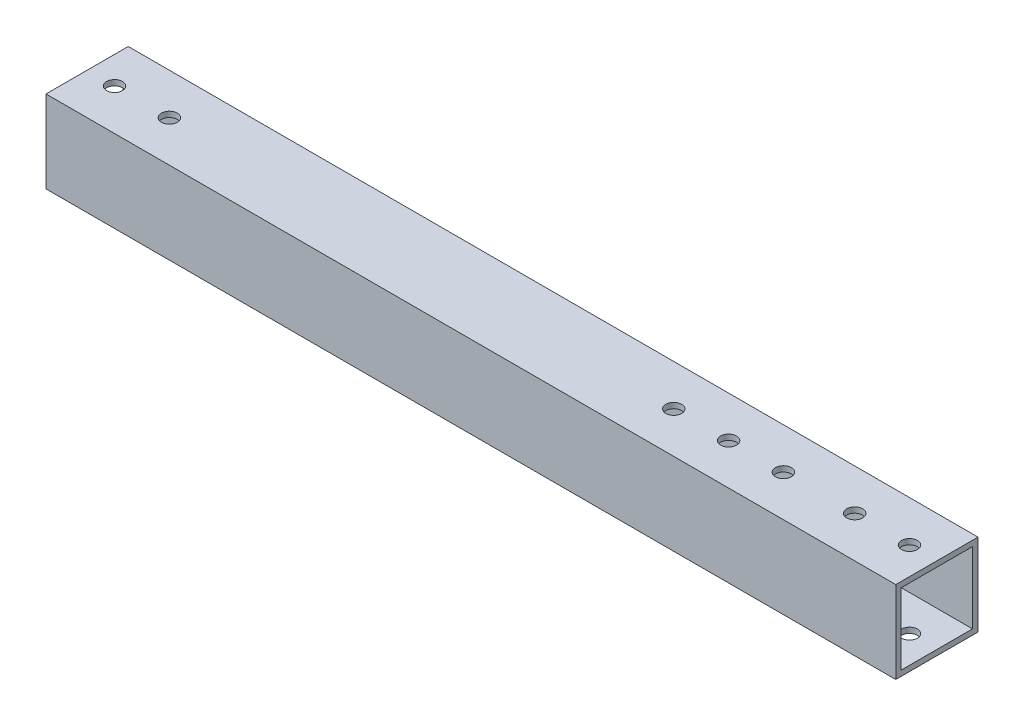
ISO-10303-21;
HEADER;
FILE_DESCRIPTION(('STEP AP214'),'2;1');
FILE_NAME('part.step','',(''),(''),'','','');
FILE_SCHEMA(('AUTOMOTIVE_DESIGN { 1 0 10303 214 1 1 1 1 }'));
ENDSEC;
DATA;
#1=APPLICATION_CONTEXT('core data for automotive mechanical design processes');
#2=APPLICATION_PROTOCOL_DEFINITION('international standard','automotive_design',2000,#1);
#3=PRODUCT_CONTEXT('',#1,'mechanical');
#4=PRODUCT('Part','Part','',(#3));
#5=PRODUCT_RELATED_PRODUCT_CATEGORY('part','',(#4));
#6=PRODUCT_DEFINITION_FORMATION('','',#4);
#7=PRODUCT_DEFINITION_CONTEXT('part definition',#1,'design');
#8=PRODUCT_DEFINITION('design','',#6,#7);
#9=PRODUCT_DEFINITION_SHAPE('','',#8);
#10=(LENGTH_UNIT() NAMED_UNIT(*) SI_UNIT(.MILLI.,.METRE.));
#11=(NAMED_UNIT(*) PLANE_ANGLE_UNIT() SI_UNIT($,.RADIAN.));
#12=(NAMED_UNIT(*) SI_UNIT($,.STERADIAN.) SOLID_ANGLE_UNIT());
#13=UNCERTAINTY_MEASURE_WITH_UNIT(LENGTH_MEASURE(1.E-05),#10,'distance_accuracy_value','');
#14=(GEOMETRIC_REPRESENTATION_CONTEXT(3) GLOBAL_UNCERTAINTY_ASSIGNED_CONTEXT((#13)) GLOBAL_UNIT_ASSIGNED_CONTEXT((#10,
#11,#12)) REPRESENTATION_CONTEXT('',''));
#15=CARTESIAN_POINT('',(0.,0.,0.));
#16=DIRECTION('',(0.,0.,1.));
#17=DIRECTION('',(1.,0.,0.));
#18=AXIS2_PLACEMENT_3D('',#15,#16,#17);
#19=CARTESIAN_POINT('',(155.,0.,0.));
#20=DIRECTION('',(-1.,0.,0.));
#21=DIRECTION('',(0.,0.,1.));
#22=AXIS2_PLACEMENT_3D('',#19,#20,#21);
#23=PLANE('',#22);
#24=DIRECTION('',(0.,1.,0.));
#25=VECTOR('',#24,1.);
#26=CARTESIAN_POINT('',(155.,-7.5,-7.5));
#27=LINE('',#26,#25);
#28=CARTESIAN_POINT('',(155.,-7.5,-7.5));
#29=VERTEX_POINT('',#28);
#30=CARTESIAN_POINT('',(155.,7.5,-7.5));
#31=VERTEX_POINT('',#30);
#32=EDGE_CURVE('E163',#29,#31,#27,.T.);
#33=ORIENTED_EDGE('',*,*,#32,.T.);
#34=DIRECTION('',(0.,0.,1.));
#35=VECTOR('',#34,1.);
#36=CARTESIAN_POINT('',(155.,7.5,7.5));
#37=LINE('',#36,#35);
#38=CARTESIAN_POINT('',(155.,7.5,7.5));
#39=VERTEX_POINT('',#38);
#40=EDGE_CURVE('E167',#31,#39,#37,.T.);
#41=ORIENTED_EDGE('',*,*,#40,.T.);
#42=DIRECTION('',(0.,-1.,0.));
#43=VECTOR('',#42,1.);
#44=CARTESIAN_POINT('',(155.,-7.5,7.5));
#45=LINE('',#44,#43);
#46=CARTESIAN_POINT('',(155.,-7.5,7.5));
#47=VERTEX_POINT('',#46);
#48=EDGE_CURVE('E171',#39,#47,#45,.T.);
#49=ORIENTED_EDGE('',*,*,#48,.T.);
#50=DIRECTION('',(0.,0.,-1.));
#51=VECTOR('',#50,1.);
#52=CARTESIAN_POINT('',(155.,-7.5,7.5));
#53=LINE('',#52,#51);
#54=EDGE_CURVE('E174',#47,#29,#53,.T.);
#55=ORIENTED_EDGE('',*,*,#54,.T.);
#56=EDGE_LOOP('',(#33,#41,#49,#55));
#57=FACE_BOUND('',#56,.T.);
#58=DIRECTION('',(0.,0.,-1.));
#59=VECTOR('',#58,1.);
#60=CARTESIAN_POINT('',(155.,-6.5,6.5));
#61=LINE('',#60,#59);
#62=CARTESIAN_POINT('',(155.,-6.5,6.5));
#63=VERTEX_POINT('',#62);
#64=CARTESIAN_POINT('',(155.,-6.5,-6.5));
#65=VERTEX_POINT('',#64);
#66=EDGE_CURVE('E112',#63,#65,#61,.T.);
#67=ORIENTED_EDGE('',*,*,#66,.F.);
#68=DIRECTION('',(0.,-1.,0.));
#69=VECTOR('',#68,1.);
#70=CARTESIAN_POINT('',(155.,-6.5,6.5));
#71=LINE('',#70,#69);
#72=CARTESIAN_POINT('',(155.,6.5,6.5));
#73=VERTEX_POINT('',#72);
#74=EDGE_CURVE('E140',#73,#63,#71,.T.);
#75=ORIENTED_EDGE('',*,*,#74,.F.);
#76=DIRECTION('',(0.,0.,1.));
#77=VECTOR('',#76,1.);
#78=CARTESIAN_POINT('',(155.,6.5,6.5));
#79=LINE('',#78,#77);
#80=CARTESIAN_POINT('',(155.,6.5,-6.5));
#81=VERTEX_POINT('',#80);
#82=EDGE_CURVE('E134',#81,#73,#79,.T.);
#83=ORIENTED_EDGE('',*,*,#82,.F.);
#84=DIRECTION('',(0.,1.,0.));
#85=VECTOR('',#84,1.);
#86=CARTESIAN_POINT('',(155.,-6.5,-6.5));
#87=LINE('',#86,#85);
#88=EDGE_CURVE('E121',#65,#81,#87,.T.);
#89=ORIENTED_EDGE('',*,*,#88,.F.);
#90=EDGE_LOOP('',(#67,#75,#83,#89));
#91=FACE_BOUND('',#90,.T.);
#92=ADVANCED_FACE('F44',(#57,#91),#23,.F.);
#93=CARTESIAN_POINT('',(0.,0.,0.));
#94=DIRECTION('',(-1.,0.,0.));
#95=DIRECTION('',(0.,0.,1.));
#96=AXIS2_PLACEMENT_3D('',#93,#94,#95);
#97=PLANE('',#96);
#98=DIRECTION('',(0.,1.,0.));
#99=VECTOR('',#98,1.);
#100=CARTESIAN_POINT('',(0.,-7.5,-7.5));
#101=LINE('',#100,#99);
#102=CARTESIAN_POINT('',(0.,-7.5,-7.5));
#103=VERTEX_POINT('',#102);
#104=CARTESIAN_POINT('',(0.,7.5,-7.5));
#105=VERTEX_POINT('',#104);
#106=EDGE_CURVE('E130',#103,#105,#101,.T.);
#107=ORIENTED_EDGE('',*,*,#106,.F.);
#108=DIRECTION('',(0.,0.,-1.));
#109=VECTOR('',#108,1.);
#110=CARTESIAN_POINT('',(0.,-7.5,7.5));
#111=LINE('',#110,#109);
#112=CARTESIAN_POINT('',(0.,-7.5,7.5));
#113=VERTEX_POINT('',#112);
#114=EDGE_CURVE('E168',#113,#103,#111,.T.);
#115=ORIENTED_EDGE('',*,*,#114,.F.);
#116=DIRECTION('',(0.,-1.,0.));
#117=VECTOR('',#116,1.);
#118=CARTESIAN_POINT('',(0.,-7.5,7.5));
#119=LINE('',#118,#117);
#120=CARTESIAN_POINT('',(0.,7.5,7.5));
#121=VERTEX_POINT('',#120);
#122=EDGE_CURVE('E184',#121,#113,#119,.T.);
#123=ORIENTED_EDGE('',*,*,#122,.F.);
#124=DIRECTION('',(0.,0.,1.));
#125=VECTOR('',#124,1.);
#126=CARTESIAN_POINT('',(0.,7.5,7.5));
#127=LINE('',#126,#125);
#128=EDGE_CURVE('E181',#105,#121,#127,.T.);
#129=ORIENTED_EDGE('',*,*,#128,.F.);
#130=EDGE_LOOP('',(#107,#115,#123,#129));
#131=FACE_BOUND('',#130,.T.);
#132=DIRECTION('',(0.,-1.,0.));
#133=VECTOR('',#132,1.);
#134=CARTESIAN_POINT('',(0.,-6.5,6.5));
#135=LINE('',#134,#133);
#136=CARTESIAN_POINT('',(0.,6.5,6.5));
#137=VERTEX_POINT('',#136);
#138=CARTESIAN_POINT('',(0.,-6.5,6.5));
#139=VERTEX_POINT('',#138);
#140=EDGE_CURVE('E122',#137,#139,#135,.T.);
#141=ORIENTED_EDGE('',*,*,#140,.T.);
#142=DIRECTION('',(0.,0.,-1.));
#143=VECTOR('',#142,1.);
#144=CARTESIAN_POINT('',(0.,-6.5,6.5));
#145=LINE('',#144,#143);
#146=CARTESIAN_POINT('',(0.,-6.5,-6.5));
#147=VERTEX_POINT('',#146);
#148=EDGE_CURVE('E70',#139,#147,#145,.T.);
#149=ORIENTED_EDGE('',*,*,#148,.T.);
#150=DIRECTION('',(0.,1.,0.));
#151=VECTOR('',#150,1.);
#152=CARTESIAN_POINT('',(0.,-6.5,-6.5));
#153=LINE('',#152,#151);
#154=CARTESIAN_POINT('',(0.,6.5,-6.5));
#155=VERTEX_POINT('',#154);
#156=EDGE_CURVE('E128',#147,#155,#153,.T.);
#157=ORIENTED_EDGE('',*,*,#156,.T.);
#158=DIRECTION('',(0.,0.,1.));
#159=VECTOR('',#158,1.);
#160=CARTESIAN_POINT('',(0.,6.5,6.5));
#161=LINE('',#160,#159);
#162=EDGE_CURVE('E151',#155,#137,#161,.T.);
#163=ORIENTED_EDGE('',*,*,#162,.T.);
#164=EDGE_LOOP('',(#141,#149,#157,#163));
#165=FACE_BOUND('',#164,.T.);
#166=ADVANCED_FACE('F273',(#131,#165),#97,.T.);
#167=CARTESIAN_POINT('',(155.,-7.5,-7.5));
#168=DIRECTION('',(0.,0.,1.));
#169=DIRECTION('',(1.,0.,0.));
#170=AXIS2_PLACEMENT_3D('',#167,#168,#169);
#171=PLANE('',#170);
#172=ORIENTED_EDGE('',*,*,#106,.T.);
#173=DIRECTION('',(-1.,0.,0.));
#174=VECTOR('',#173,1.);
#175=CARTESIAN_POINT('',(155.,7.5,-7.5));
#176=LINE('',#175,#174);
#177=EDGE_CURVE('E11',#31,#105,#176,.T.);
#178=ORIENTED_EDGE('',*,*,#177,.F.);
#179=ORIENTED_EDGE('',*,*,#32,.F.);
#180=DIRECTION('',(-1.,0.,0.));
#181=VECTOR('',#180,1.);
#182=CARTESIAN_POINT('',(155.,-7.5,-7.5));
#183=LINE('',#182,#181);
#184=EDGE_CURVE('E177',#29,#103,#183,.T.);
#185=ORIENTED_EDGE('',*,*,#184,.T.);
#186=EDGE_LOOP('',(#172,#178,#179,#185));
#187=FACE_BOUND('',#186,.T.);
#188=ADVANCED_FACE('F46',(#187),#171,.F.);
#189=CARTESIAN_POINT('',(155.,7.5,7.5));
#190=DIRECTION('',(0.,-1.,0.));
#191=DIRECTION('',(0.,0.,-1.));
#192=AXIS2_PLACEMENT_3D('',#189,#190,#191);
#193=PLANE('',#192);
#194=CARTESIAN_POINT('',(5.00000000000016,7.5,0.));
#195=DIRECTION('',(0.,1.,0.));
#196=DIRECTION('',(0.,0.,1.));
#197=AXIS2_PLACEMENT_3D('',#194,#195,#196);
#198=CIRCLE('',#197,1.45);
#199=CARTESIAN_POINT('',(5.00000000000016,7.5,1.45));
#200=VERTEX_POINT('',#199);
#201=EDGE_CURVE('E310',#200,#200,#198,.T.);
#202=ORIENTED_EDGE('',*,*,#201,.F.);
#203=EDGE_LOOP('',(#202));
#204=FACE_BOUND('',#203,.T.);
#205=CARTESIAN_POINT('',(107.,7.5,0.));
#206=DIRECTION('',(0.,1.,0.));
#207=DIRECTION('',(0.,0.,1.));
#208=AXIS2_PLACEMENT_3D('',#205,#206,#207);
#209=CIRCLE('',#208,1.45);
#210=CARTESIAN_POINT('',(107.,7.5,1.45));
#211=VERTEX_POINT('',#210);
#212=EDGE_CURVE('E314',#211,#211,#209,.T.);
#213=ORIENTED_EDGE('',*,*,#212,.F.);
#214=EDGE_LOOP('',(#213));
#215=FACE_BOUND('',#214,.T.);
#216=CARTESIAN_POINT('',(117.,7.5,0.));
#217=DIRECTION('',(0.,1.,0.));
#218=DIRECTION('',(0.,0.,1.));
#219=AXIS2_PLACEMENT_3D('',#216,#217,#218);
#220=CIRCLE('',#219,1.45);
#221=CARTESIAN_POINT('',(117.,7.5,1.45));
#222=VERTEX_POINT('',#221);
#223=EDGE_CURVE('E318',#222,#222,#220,.T.);
#224=ORIENTED_EDGE('',*,*,#223,.F.);
#225=EDGE_LOOP('',(#224));
#226=FACE_BOUND('',#225,.T.);
#227=CARTESIAN_POINT('',(15.0000000000002,7.5,0.));
#228=DIRECTION('',(0.,1.,0.));
#229=DIRECTION('',(0.,0.,1.));
#230=AXIS2_PLACEMENT_3D('',#227,#228,#229);
#231=CIRCLE('',#230,1.45);
#232=CARTESIAN_POINT('',(15.0000000000002,7.5,1.45));
#233=VERTEX_POINT('',#232);
#234=EDGE_CURVE('E322',#233,#233,#231,.T.);
#235=ORIENTED_EDGE('',*,*,#234,.F.);
#236=EDGE_LOOP('',(#235));
#237=FACE_BOUND('',#236,.T.);
#238=CARTESIAN_POINT('',(140.,7.5,0.));
#239=DIRECTION('',(0.,1.,0.));
#240=DIRECTION('',(0.,0.,1.));
#241=AXIS2_PLACEMENT_3D('',#238,#239,#240);
#242=CIRCLE('',#241,1.45);
#243=CARTESIAN_POINT('',(140.,7.5,1.45000000000002));
#244=VERTEX_POINT('',#243);
#245=EDGE_CURVE('E326',#244,#244,#242,.T.);
#246=ORIENTED_EDGE('',*,*,#245,.F.);
#247=EDGE_LOOP('',(#246));
#248=FACE_BOUND('',#247,.T.);
#249=CARTESIAN_POINT('',(150.,7.5,0.));
#250=DIRECTION('',(0.,1.,0.));
#251=DIRECTION('',(0.,0.,1.));
#252=AXIS2_PLACEMENT_3D('',#249,#250,#251);
#253=CIRCLE('',#252,1.45);
#254=CARTESIAN_POINT('',(150.,7.5,1.45000000000002));
#255=VERTEX_POINT('',#254);
#256=EDGE_CURVE('E330',#255,#255,#253,.T.);
#257=ORIENTED_EDGE('',*,*,#256,.F.);
#258=EDGE_LOOP('',(#257));
#259=FACE_BOUND('',#258,.T.);
#260=CARTESIAN_POINT('',(127.,7.5,0.));
#261=DIRECTION('',(0.,1.,0.));
#262=DIRECTION('',(0.,0.,1.));
#263=AXIS2_PLACEMENT_3D('',#260,#261,#262);
#264=CIRCLE('',#263,1.45);
#265=CARTESIAN_POINT('',(127.,7.5,1.45));
#266=VERTEX_POINT('',#265);
#267=EDGE_CURVE('E334',#266,#266,#264,.T.);
#268=ORIENTED_EDGE('',*,*,#267,.F.);
#269=EDGE_LOOP('',(#268));
#270=FACE_BOUND('',#269,.T.);
#271=ORIENTED_EDGE('',*,*,#128,.T.);
#272=DIRECTION('',(-1.,0.,0.));
#273=VECTOR('',#272,1.);
#274=CARTESIAN_POINT('',(155.,7.5,7.5));
#275=LINE('',#274,#273);
#276=EDGE_CURVE('E54',#39,#121,#275,.T.);
#277=ORIENTED_EDGE('',*,*,#276,.F.);
#278=ORIENTED_EDGE('',*,*,#40,.F.);
#279=ORIENTED_EDGE('',*,*,#177,.T.);
#280=EDGE_LOOP('',(#271,#277,#278,#279));
#281=FACE_BOUND('',#280,.T.);
#282=ADVANCED_FACE('F300',(#204,#215,#226,#237,#248,#259,#270,#281),#193,.F.);
#283=CARTESIAN_POINT('',(155.,-7.5,7.5));
#284=DIRECTION('',(0.,0.,-1.));
#285=DIRECTION('',(-1.,0.,0.));
#286=AXIS2_PLACEMENT_3D('',#283,#284,#285);
#287=PLANE('',#286);
#288=ORIENTED_EDGE('',*,*,#122,.T.);
#289=DIRECTION('',(-1.,0.,0.));
#290=VECTOR('',#289,1.);
#291=CARTESIAN_POINT('',(155.,-7.5,7.5));
#292=LINE('',#291,#290);
#293=EDGE_CURVE('E191',#47,#113,#292,.T.);
#294=ORIENTED_EDGE('',*,*,#293,.F.);
#295=ORIENTED_EDGE('',*,*,#48,.F.);
#296=ORIENTED_EDGE('',*,*,#276,.T.);
#297=EDGE_LOOP('',(#288,#294,#295,#296));
#298=FACE_BOUND('',#297,.T.);
#299=ADVANCED_FACE('F297',(#298),#287,.F.);
#300=CARTESIAN_POINT('',(155.,-7.5,7.5));
#301=DIRECTION('',(0.,1.,0.));
#302=DIRECTION('',(0.,0.,1.));
#303=AXIS2_PLACEMENT_3D('',#300,#301,#302);
#304=PLANE('',#303);
#305=CARTESIAN_POINT('',(5.00000000000016,-7.5,0.));
#306=DIRECTION('',(0.,1.,0.));
#307=DIRECTION('',(0.,0.,1.));
#308=AXIS2_PLACEMENT_3D('',#305,#306,#307);
#309=CIRCLE('',#308,1.45);
#310=CARTESIAN_POINT('',(5.00000000000016,-7.5,1.45));
#311=VERTEX_POINT('',#310);
#312=EDGE_CURVE('E203',#311,#311,#309,.T.);
#313=ORIENTED_EDGE('',*,*,#312,.T.);
#314=EDGE_LOOP('',(#313));
#315=FACE_BOUND('',#314,.T.);
#316=CARTESIAN_POINT('',(107.,-7.5,0.));
#317=DIRECTION('',(0.,1.,0.));
#318=DIRECTION('',(0.,0.,1.));
#319=AXIS2_PLACEMENT_3D('',#316,#317,#318);
#320=CIRCLE('',#319,1.45);
#321=CARTESIAN_POINT('',(107.,-7.5,1.45));
#322=VERTEX_POINT('',#321);
#323=EDGE_CURVE('E440',#322,#322,#320,.T.);
#324=ORIENTED_EDGE('',*,*,#323,.T.);
#325=EDGE_LOOP('',(#324));
#326=FACE_BOUND('',#325,.T.);
#327=CARTESIAN_POINT('',(117.,-7.5,0.));
#328=DIRECTION('',(0.,1.,0.));
#329=DIRECTION('',(0.,0.,1.));
#330=AXIS2_PLACEMENT_3D('',#327,#328,#329);
#331=CIRCLE('',#330,1.45);
#332=CARTESIAN_POINT('',(117.,-7.5,1.45));
#333=VERTEX_POINT('',#332);
#334=EDGE_CURVE('E445',#333,#333,#331,.T.);
#335=ORIENTED_EDGE('',*,*,#334,.T.);
#336=EDGE_LOOP('',(#335));
#337=FACE_BOUND('',#336,.T.);
#338=CARTESIAN_POINT('',(15.0000000000002,-7.5,0.));
#339=DIRECTION('',(0.,1.,0.));
#340=DIRECTION('',(0.,0.,1.));
#341=AXIS2_PLACEMENT_3D('',#338,#339,#340);
#342=CIRCLE('',#341,1.45);
#343=CARTESIAN_POINT('',(15.0000000000002,-7.5,1.45));
#344=VERTEX_POINT('',#343);
#345=EDGE_CURVE('E361',#344,#344,#342,.T.);
#346=ORIENTED_EDGE('',*,*,#345,.T.);
#347=EDGE_LOOP('',(#346));
#348=FACE_BOUND('',#347,.T.);
#349=CARTESIAN_POINT('',(140.,-7.5,0.));
#350=DIRECTION('',(0.,1.,0.));
#351=DIRECTION('',(0.,0.,1.));
#352=AXIS2_PLACEMENT_3D('',#349,#350,#351);
#353=CIRCLE('',#352,1.45);
#354=CARTESIAN_POINT('',(140.,-7.5,1.45000000000002));
#355=VERTEX_POINT('',#354);
#356=EDGE_CURVE('E367',#355,#355,#353,.T.);
#357=ORIENTED_EDGE('',*,*,#356,.T.);
#358=EDGE_LOOP('',(#357));
#359=FACE_BOUND('',#358,.T.);
#360=CARTESIAN_POINT('',(150.,-7.5,0.));
#361=DIRECTION('',(0.,1.,0.));
#362=DIRECTION('',(0.,0.,1.));
#363=AXIS2_PLACEMENT_3D('',#360,#361,#362);
#364=CIRCLE('',#363,1.45);
#365=CARTESIAN_POINT('',(150.,-7.5,1.45000000000002));
#366=VERTEX_POINT('',#365);
#367=EDGE_CURVE('E348',#366,#366,#364,.T.);
#368=ORIENTED_EDGE('',*,*,#367,.T.);
#369=EDGE_LOOP('',(#368));
#370=FACE_BOUND('',#369,.T.);
#371=CARTESIAN_POINT('',(127.,-7.5,0.));
#372=DIRECTION('',(0.,1.,0.));
#373=DIRECTION('',(0.,0.,1.));
#374=AXIS2_PLACEMENT_3D('',#371,#372,#373);
#375=CIRCLE('',#374,1.45);
#376=CARTESIAN_POINT('',(127.,-7.5,1.45));
#377=VERTEX_POINT('',#376);
#378=EDGE_CURVE('E349',#377,#377,#375,.T.);
#379=ORIENTED_EDGE('',*,*,#378,.T.);
#380=EDGE_LOOP('',(#379));
#381=FACE_BOUND('',#380,.T.);
#382=ORIENTED_EDGE('',*,*,#114,.T.);
#383=ORIENTED_EDGE('',*,*,#184,.F.);
#384=ORIENTED_EDGE('',*,*,#54,.F.);
#385=ORIENTED_EDGE('',*,*,#293,.T.);
#386=EDGE_LOOP('',(#382,#383,#384,#385));
#387=FACE_BOUND('',#386,.T.);
#388=ADVANCED_FACE('F294',(#315,#326,#337,#348,#359,#370,#381,#387),#304,.F.);
#389=CARTESIAN_POINT('',(155.,-6.5,6.5));
#390=DIRECTION('',(0.,1.,0.));
#391=DIRECTION('',(0.,0.,1.));
#392=AXIS2_PLACEMENT_3D('',#389,#390,#391);
#393=PLANE('',#392);
#394=CARTESIAN_POINT('',(5.00000000000016,-6.5,0.));
#395=DIRECTION('',(0.,1.,0.));
#396=DIRECTION('',(0.,0.,1.));
#397=AXIS2_PLACEMENT_3D('',#394,#395,#396);
#398=CIRCLE('',#397,1.45);
#399=CARTESIAN_POINT('',(5.00000000000016,-6.5,1.45));
#400=VERTEX_POINT('',#399);
#401=EDGE_CURVE('E148',#400,#400,#398,.T.);
#402=ORIENTED_EDGE('',*,*,#401,.F.);
#403=EDGE_LOOP('',(#402));
#404=FACE_BOUND('',#403,.T.);
#405=CARTESIAN_POINT('',(107.,-6.5,0.));
#406=DIRECTION('',(0.,1.,0.));
#407=DIRECTION('',(0.,0.,1.));
#408=AXIS2_PLACEMENT_3D('',#405,#406,#407);
#409=CIRCLE('',#408,1.45);
#410=CARTESIAN_POINT('',(107.,-6.5,1.45));
#411=VERTEX_POINT('',#410);
#412=EDGE_CURVE('E226',#411,#411,#409,.T.);
#413=ORIENTED_EDGE('',*,*,#412,.F.);
#414=EDGE_LOOP('',(#413));
#415=FACE_BOUND('',#414,.T.);
#416=CARTESIAN_POINT('',(117.,-6.5,0.));
#417=DIRECTION('',(0.,1.,0.));
#418=DIRECTION('',(0.,0.,1.));
#419=AXIS2_PLACEMENT_3D('',#416,#417,#418);
#420=CIRCLE('',#419,1.45);
#421=CARTESIAN_POINT('',(117.,-6.5,1.45));
#422=VERTEX_POINT('',#421);
#423=EDGE_CURVE('E222',#422,#422,#420,.T.);
#424=ORIENTED_EDGE('',*,*,#423,.F.);
#425=EDGE_LOOP('',(#424));
#426=FACE_BOUND('',#425,.T.);
#427=CARTESIAN_POINT('',(15.0000000000002,-6.5,0.));
#428=DIRECTION('',(0.,1.,0.));
#429=DIRECTION('',(0.,0.,1.));
#430=AXIS2_PLACEMENT_3D('',#427,#428,#429);
#431=CIRCLE('',#430,1.45);
#432=CARTESIAN_POINT('',(15.0000000000002,-6.5,1.45));
#433=VERTEX_POINT('',#432);
#434=EDGE_CURVE('E218',#433,#433,#431,.T.);
#435=ORIENTED_EDGE('',*,*,#434,.F.);
#436=EDGE_LOOP('',(#435));
#437=FACE_BOUND('',#436,.T.);
#438=CARTESIAN_POINT('',(140.,-6.5,0.));
#439=DIRECTION('',(0.,1.,0.));
#440=DIRECTION('',(0.,0.,1.));
#441=AXIS2_PLACEMENT_3D('',#438,#439,#440);
#442=CIRCLE('',#441,1.45);
#443=CARTESIAN_POINT('',(140.,-6.5,1.45000000000002));
#444=VERTEX_POINT('',#443);
#445=EDGE_CURVE('E213',#444,#444,#442,.T.);
#446=ORIENTED_EDGE('',*,*,#445,.F.);
#447=EDGE_LOOP('',(#446));
#448=FACE_BOUND('',#447,.T.);
#449=CARTESIAN_POINT('',(150.,-6.5,0.));
#450=DIRECTION('',(0.,1.,0.));
#451=DIRECTION('',(0.,0.,1.));
#452=AXIS2_PLACEMENT_3D('',#449,#450,#451);
#453=CIRCLE('',#452,1.45);
#454=CARTESIAN_POINT('',(150.,-6.5,1.45000000000002));
#455=VERTEX_POINT('',#454);
#456=EDGE_CURVE('E208',#455,#455,#453,.T.);
#457=ORIENTED_EDGE('',*,*,#456,.F.);
#458=EDGE_LOOP('',(#457));
#459=FACE_BOUND('',#458,.T.);
#460=CARTESIAN_POINT('',(127.,-6.5,0.));
#461=DIRECTION('',(0.,1.,0.));
#462=DIRECTION('',(0.,0.,1.));
#463=AXIS2_PLACEMENT_3D('',#460,#461,#462);
#464=CIRCLE('',#463,1.45);
#465=CARTESIAN_POINT('',(127.,-6.5,1.45));
#466=VERTEX_POINT('',#465);
#467=EDGE_CURVE('E202',#466,#466,#464,.T.);
#468=ORIENTED_EDGE('',*,*,#467,.F.);
#469=EDGE_LOOP('',(#468));
#470=FACE_BOUND('',#469,.T.);
#471=ORIENTED_EDGE('',*,*,#148,.F.);
#472=DIRECTION('',(-1.,0.,0.));
#473=VECTOR('',#472,1.);
#474=CARTESIAN_POINT('',(155.,-6.5,6.5));
#475=LINE('',#474,#473);
#476=EDGE_CURVE('E116',#63,#139,#475,.T.);
#477=ORIENTED_EDGE('',*,*,#476,.F.);
#478=ORIENTED_EDGE('',*,*,#66,.T.);
#479=DIRECTION('',(-1.,0.,0.));
#480=VECTOR('',#479,1.);
#481=CARTESIAN_POINT('',(155.,-6.5,-6.5));
#482=LINE('',#481,#480);
#483=EDGE_CURVE('E115',#65,#147,#482,.T.);
#484=ORIENTED_EDGE('',*,*,#483,.T.);
#485=EDGE_LOOP('',(#471,#477,#478,#484));
#486=FACE_BOUND('',#485,.T.);
#487=ADVANCED_FACE('F114',(#404,#415,#426,#437,#448,#459,#470,#486),#393,.T.);
#488=CARTESIAN_POINT('',(155.,-6.5,-6.5));
#489=DIRECTION('',(0.,0.,1.));
#490=DIRECTION('',(0.,-1.,0.));
#491=AXIS2_PLACEMENT_3D('',#488,#489,#490);
#492=PLANE('',#491);
#493=ORIENTED_EDGE('',*,*,#156,.F.);
#494=ORIENTED_EDGE('',*,*,#483,.F.);
#495=ORIENTED_EDGE('',*,*,#88,.T.);
#496=DIRECTION('',(-1.,0.,0.));
#497=VECTOR('',#496,1.);
#498=CARTESIAN_POINT('',(155.,6.5,-6.5));
#499=LINE('',#498,#497);
#500=EDGE_CURVE('E131',#81,#155,#499,.T.);
#501=ORIENTED_EDGE('',*,*,#500,.T.);
#502=EDGE_LOOP('',(#493,#494,#495,#501));
#503=FACE_BOUND('',#502,.T.);
#504=ADVANCED_FACE('F125',(#503),#492,.T.);
#505=CARTESIAN_POINT('',(155.,6.5,6.5));
#506=DIRECTION('',(0.,-1.,0.));
#507=DIRECTION('',(0.,0.,-1.));
#508=AXIS2_PLACEMENT_3D('',#505,#506,#507);
#509=PLANE('',#508);
#510=CARTESIAN_POINT('',(5.00000000000016,6.5,0.));
#511=DIRECTION('',(0.,-1.,0.));
#512=DIRECTION('',(0.,0.,-1.));
#513=AXIS2_PLACEMENT_3D('',#510,#511,#512);
#514=CIRCLE('',#513,1.45);
#515=CARTESIAN_POINT('',(5.00000000000016,6.5,-1.45));
#516=VERTEX_POINT('',#515);
#517=EDGE_CURVE('E48',#516,#516,#514,.T.);
#518=ORIENTED_EDGE('',*,*,#517,.F.);
#519=EDGE_LOOP('',(#518));
#520=FACE_BOUND('',#519,.T.);
#521=CARTESIAN_POINT('',(107.,6.5,0.));
#522=DIRECTION('',(0.,-1.,0.));
#523=DIRECTION('',(0.,0.,-1.));
#524=AXIS2_PLACEMENT_3D('',#521,#522,#523);
#525=CIRCLE('',#524,1.45);
#526=CARTESIAN_POINT('',(107.,6.5,-1.45));
#527=VERTEX_POINT('',#526);
#528=EDGE_CURVE('E223',#527,#527,#525,.T.);
#529=ORIENTED_EDGE('',*,*,#528,.F.);
#530=EDGE_LOOP('',(#529));
#531=FACE_BOUND('',#530,.T.);
#532=CARTESIAN_POINT('',(117.,6.5,0.));
#533=DIRECTION('',(0.,-1.,0.));
#534=DIRECTION('',(0.,0.,-1.));
#535=AXIS2_PLACEMENT_3D('',#532,#533,#534);
#536=CIRCLE('',#535,1.45);
#537=CARTESIAN_POINT('',(117.,6.5,-1.45));
#538=VERTEX_POINT('',#537);
#539=EDGE_CURVE('E219',#538,#538,#536,.T.);
#540=ORIENTED_EDGE('',*,*,#539,.F.);
#541=EDGE_LOOP('',(#540));
#542=FACE_BOUND('',#541,.T.);
#543=CARTESIAN_POINT('',(15.0000000000002,6.5,0.));
#544=DIRECTION('',(0.,-1.,0.));
#545=DIRECTION('',(0.,0.,-1.));
#546=AXIS2_PLACEMENT_3D('',#543,#544,#545);
#547=CIRCLE('',#546,1.45);
#548=CARTESIAN_POINT('',(15.0000000000002,6.5,-1.45));
#549=VERTEX_POINT('',#548);
#550=EDGE_CURVE('E214',#549,#549,#547,.T.);
#551=ORIENTED_EDGE('',*,*,#550,.F.);
#552=EDGE_LOOP('',(#551));
#553=FACE_BOUND('',#552,.T.);
#554=CARTESIAN_POINT('',(140.,6.5,0.));
#555=DIRECTION('',(0.,-1.,0.));
#556=DIRECTION('',(0.,0.,-1.));
#557=AXIS2_PLACEMENT_3D('',#554,#555,#556);
#558=CIRCLE('',#557,1.45);
#559=CARTESIAN_POINT('',(140.,6.5,-1.44999999999998));
#560=VERTEX_POINT('',#559);
#561=EDGE_CURVE('E209',#560,#560,#558,.T.);
#562=ORIENTED_EDGE('',*,*,#561,.F.);
#563=EDGE_LOOP('',(#562));
#564=FACE_BOUND('',#563,.T.);
#565=CARTESIAN_POINT('',(150.,6.5,0.));
#566=DIRECTION('',(0.,-1.,0.));
#567=DIRECTION('',(0.,0.,-1.));
#568=AXIS2_PLACEMENT_3D('',#565,#566,#567);
#569=CIRCLE('',#568,1.45);
#570=CARTESIAN_POINT('',(150.,6.5,-1.44999999999998));
#571=VERTEX_POINT('',#570);
#572=EDGE_CURVE('E204',#571,#571,#569,.T.);
#573=ORIENTED_EDGE('',*,*,#572,.F.);
#574=EDGE_LOOP('',(#573));
#575=FACE_BOUND('',#574,.T.);
#576=CARTESIAN_POINT('',(127.,6.5,0.));
#577=DIRECTION('',(0.,-1.,0.));
#578=DIRECTION('',(0.,0.,-1.));
#579=AXIS2_PLACEMENT_3D('',#576,#577,#578);
#580=CIRCLE('',#579,1.45);
#581=CARTESIAN_POINT('',(127.,6.5,-1.45));
#582=VERTEX_POINT('',#581);
#583=EDGE_CURVE('E198',#582,#582,#580,.T.);
#584=ORIENTED_EDGE('',*,*,#583,.F.);
#585=EDGE_LOOP('',(#584));
#586=FACE_BOUND('',#585,.T.);
#587=ORIENTED_EDGE('',*,*,#162,.F.);
#588=ORIENTED_EDGE('',*,*,#500,.F.);
#589=ORIENTED_EDGE('',*,*,#82,.T.);
#590=DIRECTION('',(-1.,0.,0.));
#591=VECTOR('',#590,1.);
#592=CARTESIAN_POINT('',(155.,6.5,6.5));
#593=LINE('',#592,#591);
#594=EDGE_CURVE('E62',#73,#137,#593,.T.);
#595=ORIENTED_EDGE('',*,*,#594,.T.);
#596=EDGE_LOOP('',(#587,#588,#589,#595));
#597=FACE_BOUND('',#596,.T.);
#598=ADVANCED_FACE('F255',(#520,#531,#542,#553,#564,#575,#586,#597),#509,.T.);
#599=CARTESIAN_POINT('',(155.,-6.5,6.5));
#600=DIRECTION('',(0.,0.,-1.));
#601=DIRECTION('',(-1.,0.,0.));
#602=AXIS2_PLACEMENT_3D('',#599,#600,#601);
#603=PLANE('',#602);
#604=ORIENTED_EDGE('',*,*,#140,.F.);
#605=ORIENTED_EDGE('',*,*,#594,.F.);
#606=ORIENTED_EDGE('',*,*,#74,.T.);
#607=ORIENTED_EDGE('',*,*,#476,.T.);
#608=EDGE_LOOP('',(#604,#605,#606,#607));
#609=FACE_BOUND('',#608,.T.);
#610=ADVANCED_FACE('F258',(#609),#603,.T.);
#611=CARTESIAN_POINT('',(127.,-7.5,0.));
#612=DIRECTION('',(0.,1.,0.));
#613=DIRECTION('',(0.,0.,1.));
#614=AXIS2_PLACEMENT_3D('',#611,#612,#613);
#615=CYLINDRICAL_SURFACE('',#614,1.45);
#616=ORIENTED_EDGE('',*,*,#583,.T.);
#617=EDGE_LOOP('',(#616));
#618=FACE_BOUND('',#617,.T.);
#619=ORIENTED_EDGE('',*,*,#267,.T.);
#620=EDGE_LOOP('',(#619));
#621=FACE_BOUND('',#620,.T.);
#622=ADVANCED_FACE('F275',(#618,#621),#615,.F.);
#623=CARTESIAN_POINT('',(150.,-7.5,0.));
#624=DIRECTION('',(0.,1.,0.));
#625=DIRECTION('',(0.,0.,1.));
#626=AXIS2_PLACEMENT_3D('',#623,#624,#625);
#627=CYLINDRICAL_SURFACE('',#626,1.45);
#628=ORIENTED_EDGE('',*,*,#572,.T.);
#629=EDGE_LOOP('',(#628));
#630=FACE_BOUND('',#629,.T.);
#631=ORIENTED_EDGE('',*,*,#256,.T.);
#632=EDGE_LOOP('',(#631));
#633=FACE_BOUND('',#632,.T.);
#634=ADVANCED_FACE('F279',(#630,#633),#627,.F.);
#635=CARTESIAN_POINT('',(140.,-7.5,0.));
#636=DIRECTION('',(0.,1.,0.));
#637=DIRECTION('',(0.,0.,1.));
#638=AXIS2_PLACEMENT_3D('',#635,#636,#637);
#639=CYLINDRICAL_SURFACE('',#638,1.45);
#640=ORIENTED_EDGE('',*,*,#561,.T.);
#641=EDGE_LOOP('',(#640));
#642=FACE_BOUND('',#641,.T.);
#643=ORIENTED_EDGE('',*,*,#245,.T.);
#644=EDGE_LOOP('',(#643));
#645=FACE_BOUND('',#644,.T.);
#646=ADVANCED_FACE('F408',(#642,#645),#639,.F.);
#647=CARTESIAN_POINT('',(15.0000000000002,-7.5,0.));
#648=DIRECTION('',(0.,1.,0.));
#649=DIRECTION('',(0.,0.,1.));
#650=AXIS2_PLACEMENT_3D('',#647,#648,#649);
#651=CYLINDRICAL_SURFACE('',#650,1.45);
#652=ORIENTED_EDGE('',*,*,#550,.T.);
#653=EDGE_LOOP('',(#652));
#654=FACE_BOUND('',#653,.T.);
#655=ORIENTED_EDGE('',*,*,#234,.T.);
#656=EDGE_LOOP('',(#655));
#657=FACE_BOUND('',#656,.T.);
#658=ADVANCED_FACE('F405',(#654,#657),#651,.F.);
#659=CARTESIAN_POINT('',(117.,-7.5,0.));
#660=DIRECTION('',(0.,1.,0.));
#661=DIRECTION('',(0.,0.,1.));
#662=AXIS2_PLACEMENT_3D('',#659,#660,#661);
#663=CYLINDRICAL_SURFACE('',#662,1.45);
#664=ORIENTED_EDGE('',*,*,#539,.T.);
#665=EDGE_LOOP('',(#664));
#666=FACE_BOUND('',#665,.T.);
#667=ORIENTED_EDGE('',*,*,#223,.T.);
#668=EDGE_LOOP('',(#667));
#669=FACE_BOUND('',#668,.T.);
#670=ADVANCED_FACE('F407',(#666,#669),#663,.F.);
#671=CARTESIAN_POINT('',(107.,-7.5,0.));
#672=DIRECTION('',(0.,1.,0.));
#673=DIRECTION('',(0.,0.,1.));
#674=AXIS2_PLACEMENT_3D('',#671,#672,#673);
#675=CYLINDRICAL_SURFACE('',#674,1.45);
#676=ORIENTED_EDGE('',*,*,#528,.T.);
#677=EDGE_LOOP('',(#676));
#678=FACE_BOUND('',#677,.T.);
#679=ORIENTED_EDGE('',*,*,#212,.T.);
#680=EDGE_LOOP('',(#679));
#681=FACE_BOUND('',#680,.T.);
#682=ADVANCED_FACE('F400',(#678,#681),#675,.F.);
#683=CARTESIAN_POINT('',(5.00000000000016,-7.5,0.));
#684=DIRECTION('',(0.,1.,0.));
#685=DIRECTION('',(0.,0.,1.));
#686=AXIS2_PLACEMENT_3D('',#683,#684,#685);
#687=CYLINDRICAL_SURFACE('',#686,1.45);
#688=ORIENTED_EDGE('',*,*,#517,.T.);
#689=EDGE_LOOP('',(#688));
#690=FACE_BOUND('',#689,.T.);
#691=ORIENTED_EDGE('',*,*,#201,.T.);
#692=EDGE_LOOP('',(#691));
#693=FACE_BOUND('',#692,.T.);
#694=ADVANCED_FACE('F252',(#690,#693),#687,.F.);
#695=ORIENTED_EDGE('',*,*,#467,.T.);
#696=EDGE_LOOP('',(#695));
#697=FACE_BOUND('',#696,.T.);
#698=ORIENTED_EDGE('',*,*,#378,.F.);
#699=EDGE_LOOP('',(#698));
#700=FACE_BOUND('',#699,.T.);
#701=ADVANCED_FACE('F282',(#697,#700),#615,.F.);
#702=ORIENTED_EDGE('',*,*,#456,.T.);
#703=EDGE_LOOP('',(#702));
#704=FACE_BOUND('',#703,.T.);
#705=ORIENTED_EDGE('',*,*,#367,.F.);
#706=EDGE_LOOP('',(#705));
#707=FACE_BOUND('',#706,.T.);
#708=ADVANCED_FACE('F392',(#704,#707),#627,.F.);
#709=ORIENTED_EDGE('',*,*,#445,.T.);
#710=EDGE_LOOP('',(#709));
#711=FACE_BOUND('',#710,.T.);
#712=ORIENTED_EDGE('',*,*,#356,.F.);
#713=EDGE_LOOP('',(#712));
#714=FACE_BOUND('',#713,.T.);
#715=ADVANCED_FACE('F380',(#711,#714),#639,.F.);
#716=ORIENTED_EDGE('',*,*,#434,.T.);
#717=EDGE_LOOP('',(#716));
#718=FACE_BOUND('',#717,.T.);
#719=ORIENTED_EDGE('',*,*,#345,.F.);
#720=EDGE_LOOP('',(#719));
#721=FACE_BOUND('',#720,.T.);
#722=ADVANCED_FACE('F410',(#718,#721),#651,.F.);
#723=ORIENTED_EDGE('',*,*,#423,.T.);
#724=EDGE_LOOP('',(#723));
#725=FACE_BOUND('',#724,.T.);
#726=ORIENTED_EDGE('',*,*,#334,.F.);
#727=EDGE_LOOP('',(#726));
#728=FACE_BOUND('',#727,.T.);
#729=ADVANCED_FACE('F420',(#725,#728),#663,.F.);
#730=ORIENTED_EDGE('',*,*,#412,.T.);
#731=EDGE_LOOP('',(#730));
#732=FACE_BOUND('',#731,.T.);
#733=ORIENTED_EDGE('',*,*,#323,.F.);
#734=EDGE_LOOP('',(#733));
#735=FACE_BOUND('',#734,.T.);
#736=ADVANCED_FACE('F424',(#732,#735),#675,.F.);
#737=ORIENTED_EDGE('',*,*,#401,.T.);
#738=EDGE_LOOP('',(#737));
#739=FACE_BOUND('',#738,.T.);
#740=ORIENTED_EDGE('',*,*,#312,.F.);
#741=EDGE_LOOP('',(#740));
#742=FACE_BOUND('',#741,.T.);
#743=ADVANCED_FACE('F402',(#739,#742),#687,.F.);
#744=CLOSED_SHELL('',(#92,#166,#188,#282,#299,#388,#487,#504,#598,#610,#622,#634,#646,#658,#670,
#682,#694,#701,#708,#715,#722,#729,#736,#743));
#745=MANIFOLD_SOLID_BREP('B2',#744);
#746=ADVANCED_BREP_SHAPE_REPRESENTATION('',(#18,#745),#14);
#747=SHAPE_DEFINITION_REPRESENTATION(#9,#746);
ENDSEC;
END-ISO-10303-21;
